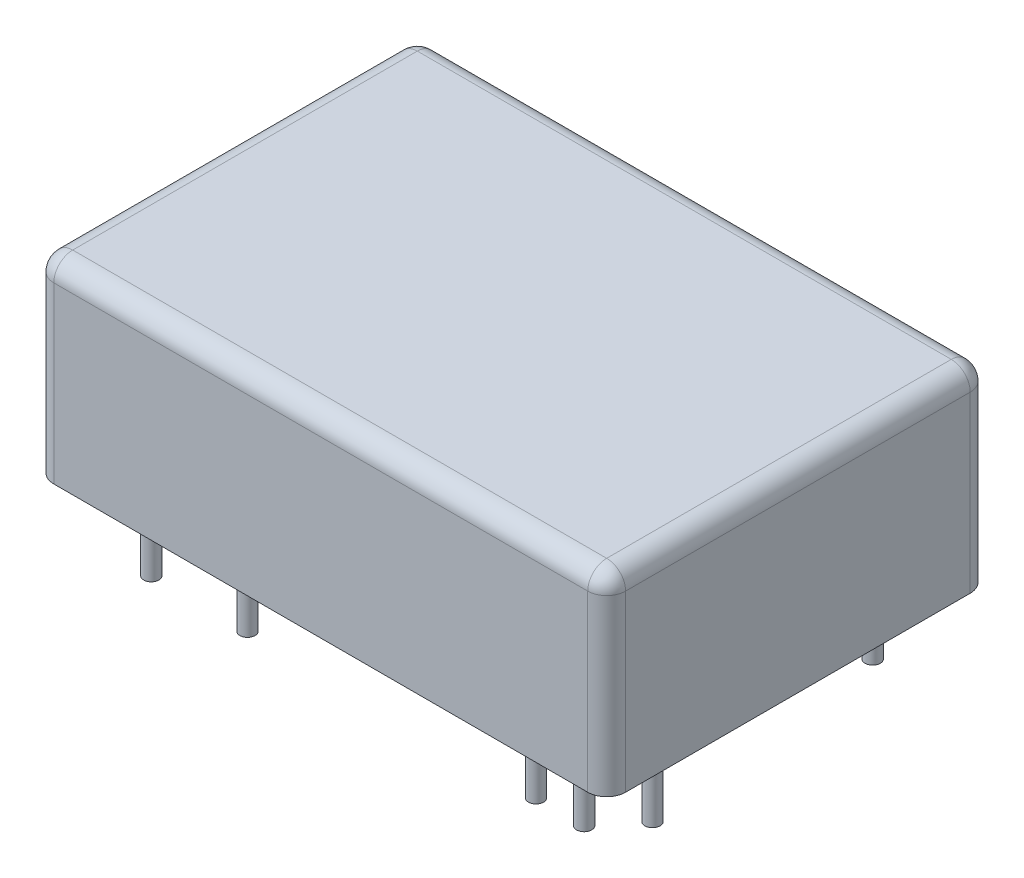
ISO-10303-21;
HEADER;
FILE_DESCRIPTION(('STEP AP214'),'2;1');
FILE_NAME('part.step','',(''),(''),'','','');
FILE_SCHEMA(('AUTOMOTIVE_DESIGN { 1 0 10303 214 1 1 1 1 }'));
ENDSEC;
DATA;
#1=APPLICATION_CONTEXT('core data for automotive mechanical design processes');
#2=APPLICATION_PROTOCOL_DEFINITION('international standard','automotive_design',2000,#1);
#3=PRODUCT_CONTEXT('',#1,'mechanical');
#4=PRODUCT('Part','Part','',(#3));
#5=PRODUCT_RELATED_PRODUCT_CATEGORY('part','',(#4));
#6=PRODUCT_DEFINITION_FORMATION('','',#4);
#7=PRODUCT_DEFINITION_CONTEXT('part definition',#1,'design');
#8=PRODUCT_DEFINITION('design','',#6,#7);
#9=PRODUCT_DEFINITION_SHAPE('','',#8);
#10=(LENGTH_UNIT() NAMED_UNIT(*) SI_UNIT(.MILLI.,.METRE.));
#11=(NAMED_UNIT(*) PLANE_ANGLE_UNIT() SI_UNIT($,.RADIAN.));
#12=(NAMED_UNIT(*) SI_UNIT($,.STERADIAN.) SOLID_ANGLE_UNIT());
#13=UNCERTAINTY_MEASURE_WITH_UNIT(LENGTH_MEASURE(1.E-05),#10,'distance_accuracy_value','');
#14=(GEOMETRIC_REPRESENTATION_CONTEXT(3) GLOBAL_UNCERTAINTY_ASSIGNED_CONTEXT((#13)) GLOBAL_UNIT_ASSIGNED_CONTEXT((#10,
#11,#12)) REPRESENTATION_CONTEXT('',''));
#15=CARTESIAN_POINT('',(0.,0.,0.));
#16=DIRECTION('',(0.,0.,1.));
#17=DIRECTION('',(1.,0.,0.));
#18=AXIS2_PLACEMENT_3D('',#15,#16,#17);
#19=CARTESIAN_POINT('',(15.1,10.2,-10.1));
#20=DIRECTION('',(-1.,0.,0.));
#21=DIRECTION('',(0.,0.,1.));
#22=AXIS2_PLACEMENT_3D('',#19,#20,#21);
#23=PLANE('',#22);
#24=DIRECTION('',(0.,0.,-1.));
#25=VECTOR('',#24,1.);
#26=CARTESIAN_POINT('',(15.1,0.,-10.1));
#27=LINE('',#26,#25);
#28=CARTESIAN_POINT('',(15.1,0.,9.1));
#29=VERTEX_POINT('',#28);
#30=CARTESIAN_POINT('',(15.1,0.,-9.1));
#31=VERTEX_POINT('',#30);
#32=EDGE_CURVE('E205',#29,#31,#27,.T.);
#33=ORIENTED_EDGE('',*,*,#32,.T.);
#34=DIRECTION('',(0.,-1.,0.));
#35=VECTOR('',#34,1.);
#36=CARTESIAN_POINT('',(15.1,10.2,-9.1));
#37=LINE('',#36,#35);
#38=CARTESIAN_POINT('',(15.1,9.2,-9.1));
#39=VERTEX_POINT('',#38);
#40=EDGE_CURVE('E50',#31,#39,#37,.F.);
#41=ORIENTED_EDGE('',*,*,#40,.T.);
#42=DIRECTION('',(0.,0.,-1.));
#43=VECTOR('',#42,1.);
#44=CARTESIAN_POINT('',(15.1,9.2,10.1));
#45=LINE('',#44,#43);
#46=CARTESIAN_POINT('',(15.1,9.2,9.1));
#47=VERTEX_POINT('',#46);
#48=EDGE_CURVE('E55',#39,#47,#45,.F.);
#49=ORIENTED_EDGE('',*,*,#48,.T.);
#50=DIRECTION('',(0.,-1.,0.));
#51=VECTOR('',#50,1.);
#52=CARTESIAN_POINT('',(15.1,10.2,9.1));
#53=LINE('',#52,#51);
#54=EDGE_CURVE('E169',#47,#29,#53,.T.);
#55=ORIENTED_EDGE('',*,*,#54,.T.);
#56=EDGE_LOOP('',(#33,#41,#49,#55));
#57=FACE_BOUND('',#56,.T.);
#58=ADVANCED_FACE('F35',(#57),#23,.F.);
#59=CARTESIAN_POINT('',(-15.1,10.2,-10.1));
#60=DIRECTION('',(0.,0.,1.));
#61=DIRECTION('',(1.,0.,0.));
#62=AXIS2_PLACEMENT_3D('',#59,#60,#61);
#63=PLANE('',#62);
#64=DIRECTION('',(-1.,0.,0.));
#65=VECTOR('',#64,1.);
#66=CARTESIAN_POINT('',(-15.1,0.,-10.1));
#67=LINE('',#66,#65);
#68=CARTESIAN_POINT('',(14.1,0.,-10.1));
#69=VERTEX_POINT('',#68);
#70=CARTESIAN_POINT('',(-14.1,0.,-10.1));
#71=VERTEX_POINT('',#70);
#72=EDGE_CURVE('E287',#69,#71,#67,.T.);
#73=ORIENTED_EDGE('',*,*,#72,.T.);
#74=DIRECTION('',(0.,-1.,0.));
#75=VECTOR('',#74,1.);
#76=CARTESIAN_POINT('',(-14.1,10.2,-10.1));
#77=LINE('',#76,#75);
#78=CARTESIAN_POINT('',(-14.1,9.2,-10.1));
#79=VERTEX_POINT('',#78);
#80=EDGE_CURVE('E167',#71,#79,#77,.F.);
#81=ORIENTED_EDGE('',*,*,#80,.T.);
#82=DIRECTION('',(-1.,0.,0.));
#83=VECTOR('',#82,1.);
#84=CARTESIAN_POINT('',(15.1,9.2,-10.1));
#85=LINE('',#84,#83);
#86=CARTESIAN_POINT('',(14.1,9.2,-10.1));
#87=VERTEX_POINT('',#86);
#88=EDGE_CURVE('E165',#79,#87,#85,.F.);
#89=ORIENTED_EDGE('',*,*,#88,.T.);
#90=DIRECTION('',(0.,-1.,0.));
#91=VECTOR('',#90,1.);
#92=CARTESIAN_POINT('',(14.1,10.2,-10.1));
#93=LINE('',#92,#91);
#94=EDGE_CURVE('E163',#87,#69,#93,.T.);
#95=ORIENTED_EDGE('',*,*,#94,.T.);
#96=EDGE_LOOP('',(#73,#81,#89,#95));
#97=FACE_BOUND('',#96,.T.);
#98=ADVANCED_FACE('F297',(#97),#63,.F.);
#99=CARTESIAN_POINT('',(-15.1,10.2,-10.1));
#100=DIRECTION('',(1.,0.,0.));
#101=DIRECTION('',(0.,0.,-1.));
#102=AXIS2_PLACEMENT_3D('',#99,#100,#101);
#103=PLANE('',#102);
#104=DIRECTION('',(0.,0.,1.));
#105=VECTOR('',#104,1.);
#106=CARTESIAN_POINT('',(-15.1,0.,-10.1));
#107=LINE('',#106,#105);
#108=CARTESIAN_POINT('',(-15.1,0.,-9.1));
#109=VERTEX_POINT('',#108);
#110=CARTESIAN_POINT('',(-15.1,0.,9.1));
#111=VERTEX_POINT('',#110);
#112=EDGE_CURVE('E263',#109,#111,#107,.T.);
#113=ORIENTED_EDGE('',*,*,#112,.T.);
#114=DIRECTION('',(0.,-1.,0.));
#115=VECTOR('',#114,1.);
#116=CARTESIAN_POINT('',(-15.1,10.2,9.1));
#117=LINE('',#116,#115);
#118=CARTESIAN_POINT('',(-15.1,9.2,9.1));
#119=VERTEX_POINT('',#118);
#120=EDGE_CURVE('E161',#111,#119,#117,.F.);
#121=ORIENTED_EDGE('',*,*,#120,.T.);
#122=DIRECTION('',(0.,0.,1.));
#123=VECTOR('',#122,1.);
#124=CARTESIAN_POINT('',(-15.1,9.2,-10.1));
#125=LINE('',#124,#123);
#126=CARTESIAN_POINT('',(-15.1,9.2,-9.1));
#127=VERTEX_POINT('',#126);
#128=EDGE_CURVE('E159',#119,#127,#125,.F.);
#129=ORIENTED_EDGE('',*,*,#128,.T.);
#130=DIRECTION('',(0.,-1.,0.));
#131=VECTOR('',#130,1.);
#132=CARTESIAN_POINT('',(-15.1,10.2,-9.1));
#133=LINE('',#132,#131);
#134=EDGE_CURVE('E157',#127,#109,#133,.T.);
#135=ORIENTED_EDGE('',*,*,#134,.T.);
#136=EDGE_LOOP('',(#113,#121,#129,#135));
#137=FACE_BOUND('',#136,.T.);
#138=ADVANCED_FACE('F272',(#137),#103,.F.);
#139=CARTESIAN_POINT('',(-15.1,10.2,10.1));
#140=DIRECTION('',(0.,0.,-1.));
#141=DIRECTION('',(-1.,0.,0.));
#142=AXIS2_PLACEMENT_3D('',#139,#140,#141);
#143=PLANE('',#142);
#144=DIRECTION('',(1.,0.,0.));
#145=VECTOR('',#144,1.);
#146=CARTESIAN_POINT('',(-15.1,9.2,10.1));
#147=LINE('',#146,#145);
#148=CARTESIAN_POINT('',(14.1,9.2,10.1));
#149=VERTEX_POINT('',#148);
#150=CARTESIAN_POINT('',(-14.1,9.2,10.1));
#151=VERTEX_POINT('',#150);
#152=EDGE_CURVE('E119',#149,#151,#147,.F.);
#153=ORIENTED_EDGE('',*,*,#152,.T.);
#154=DIRECTION('',(0.,-1.,0.));
#155=VECTOR('',#154,1.);
#156=CARTESIAN_POINT('',(-14.1,10.2,10.1));
#157=LINE('',#156,#155);
#158=CARTESIAN_POINT('',(-14.1,0.,10.1));
#159=VERTEX_POINT('',#158);
#160=EDGE_CURVE('E155',#151,#159,#157,.T.);
#161=ORIENTED_EDGE('',*,*,#160,.T.);
#162=DIRECTION('',(1.,0.,0.));
#163=VECTOR('',#162,1.);
#164=CARTESIAN_POINT('',(-15.1,0.,10.1));
#165=LINE('',#164,#163);
#166=CARTESIAN_POINT('',(14.1,0.,10.1));
#167=VERTEX_POINT('',#166);
#168=EDGE_CURVE('E142',#159,#167,#165,.T.);
#169=ORIENTED_EDGE('',*,*,#168,.T.);
#170=DIRECTION('',(0.,-1.,0.));
#171=VECTOR('',#170,1.);
#172=CARTESIAN_POINT('',(14.1,10.2,10.1));
#173=LINE('',#172,#171);
#174=EDGE_CURVE('E148',#167,#149,#173,.F.);
#175=ORIENTED_EDGE('',*,*,#174,.T.);
#176=EDGE_LOOP('',(#153,#161,#169,#175));
#177=FACE_BOUND('',#176,.T.);
#178=ADVANCED_FACE('F399',(#177),#143,.F.);
#179=CARTESIAN_POINT('',(0.,10.2,0.));
#180=DIRECTION('',(0.,1.,0.));
#181=DIRECTION('',(0.,0.,1.));
#182=AXIS2_PLACEMENT_3D('',#179,#180,#181);
#183=PLANE('',#182);
#184=DIRECTION('',(0.,0.,1.));
#185=VECTOR('',#184,1.);
#186=CARTESIAN_POINT('',(-14.1,10.2,10.1));
#187=LINE('',#186,#185);
#188=CARTESIAN_POINT('',(-14.1,10.2,-9.1));
#189=VERTEX_POINT('',#188);
#190=CARTESIAN_POINT('',(-14.1,10.2,9.1));
#191=VERTEX_POINT('',#190);
#192=EDGE_CURVE('E146',#189,#191,#187,.T.);
#193=ORIENTED_EDGE('',*,*,#192,.T.);
#194=DIRECTION('',(1.,0.,0.));
#195=VECTOR('',#194,1.);
#196=CARTESIAN_POINT('',(15.1,10.2,9.1));
#197=LINE('',#196,#195);
#198=CARTESIAN_POINT('',(14.1,10.2,9.1));
#199=VERTEX_POINT('',#198);
#200=EDGE_CURVE('E117',#191,#199,#197,.T.);
#201=ORIENTED_EDGE('',*,*,#200,.T.);
#202=DIRECTION('',(0.,0.,-1.));
#203=VECTOR('',#202,1.);
#204=CARTESIAN_POINT('',(14.1,10.2,-10.1));
#205=LINE('',#204,#203);
#206=CARTESIAN_POINT('',(14.1,10.2,-9.1));
#207=VERTEX_POINT('',#206);
#208=EDGE_CURVE('E135',#199,#207,#205,.T.);
#209=ORIENTED_EDGE('',*,*,#208,.T.);
#210=DIRECTION('',(-1.,0.,0.));
#211=VECTOR('',#210,1.);
#212=CARTESIAN_POINT('',(-15.1,10.2,-9.1));
#213=LINE('',#212,#211);
#214=EDGE_CURVE('E141',#207,#189,#213,.T.);
#215=ORIENTED_EDGE('',*,*,#214,.T.);
#216=EDGE_LOOP('',(#193,#201,#209,#215));
#217=FACE_BOUND('',#216,.T.);
#218=ADVANCED_FACE('F144',(#217),#183,.T.);
#219=CARTESIAN_POINT('',(0.,0.,0.));
#220=DIRECTION('',(0.,1.,0.));
#221=DIRECTION('',(0.,0.,1.));
#222=AXIS2_PLACEMENT_3D('',#219,#220,#221);
#223=PLANE('',#222);
#224=CARTESIAN_POINT('',(11.53,0.,-7.52));
#225=DIRECTION('',(0.,1.,0.));
#226=DIRECTION('',(0.,0.,1.));
#227=AXIS2_PLACEMENT_3D('',#224,#225,#226);
#228=CIRCLE('',#227,0.399999999999998);
#229=CARTESIAN_POINT('',(11.53,0.,-7.12));
#230=VERTEX_POINT('',#229);
#231=EDGE_CURVE('E11',#230,#230,#228,.F.);
#232=ORIENTED_EDGE('',*,*,#231,.F.);
#233=EDGE_LOOP('',(#232));
#234=FACE_BOUND('',#233,.T.);
#235=CARTESIAN_POINT('',(8.99,0.,-7.52));
#236=DIRECTION('',(0.,1.,0.));
#237=DIRECTION('',(0.,0.,1.));
#238=AXIS2_PLACEMENT_3D('',#235,#236,#237);
#239=CIRCLE('',#238,0.399999999999998);
#240=CARTESIAN_POINT('',(8.99,0.,-7.12));
#241=VERTEX_POINT('',#240);
#242=EDGE_CURVE('E43',#241,#241,#239,.F.);
#243=ORIENTED_EDGE('',*,*,#242,.F.);
#244=EDGE_LOOP('',(#243));
#245=FACE_BOUND('',#244,.T.);
#246=CARTESIAN_POINT('',(-6.25,0.,-7.52));
#247=DIRECTION('',(0.,1.,0.));
#248=DIRECTION('',(0.,0.,1.));
#249=AXIS2_PLACEMENT_3D('',#246,#247,#248);
#250=CIRCLE('',#249,0.399999999999998);
#251=CARTESIAN_POINT('',(-6.25,0.,-7.12));
#252=VERTEX_POINT('',#251);
#253=EDGE_CURVE('E226',#252,#252,#250,.F.);
#254=ORIENTED_EDGE('',*,*,#253,.F.);
#255=EDGE_LOOP('',(#254));
#256=FACE_BOUND('',#255,.T.);
#257=CARTESIAN_POINT('',(-11.33,0.,-7.52));
#258=DIRECTION('',(0.,1.,0.));
#259=DIRECTION('',(0.,0.,1.));
#260=AXIS2_PLACEMENT_3D('',#257,#258,#259);
#261=CIRCLE('',#260,0.399999999999998);
#262=CARTESIAN_POINT('',(-11.33,0.,-7.12));
#263=VERTEX_POINT('',#262);
#264=EDGE_CURVE('E223',#263,#263,#261,.F.);
#265=ORIENTED_EDGE('',*,*,#264,.F.);
#266=EDGE_LOOP('',(#265));
#267=FACE_BOUND('',#266,.T.);
#268=CARTESIAN_POINT('',(-11.33,0.,7.72));
#269=DIRECTION('',(0.,1.,0.));
#270=DIRECTION('',(0.,0.,1.));
#271=AXIS2_PLACEMENT_3D('',#268,#269,#270);
#272=CIRCLE('',#271,0.399999999999998);
#273=CARTESIAN_POINT('',(-11.33,0.,8.12));
#274=VERTEX_POINT('',#273);
#275=EDGE_CURVE('E220',#274,#274,#272,.F.);
#276=ORIENTED_EDGE('',*,*,#275,.F.);
#277=EDGE_LOOP('',(#276));
#278=FACE_BOUND('',#277,.T.);
#279=CARTESIAN_POINT('',(-6.25,0.,7.72));
#280=DIRECTION('',(0.,1.,0.));
#281=DIRECTION('',(0.,0.,1.));
#282=AXIS2_PLACEMENT_3D('',#279,#280,#281);
#283=CIRCLE('',#282,0.399999999999998);
#284=CARTESIAN_POINT('',(-6.25,0.,8.12));
#285=VERTEX_POINT('',#284);
#286=EDGE_CURVE('E217',#285,#285,#283,.F.);
#287=ORIENTED_EDGE('',*,*,#286,.F.);
#288=EDGE_LOOP('',(#287));
#289=FACE_BOUND('',#288,.T.);
#290=CARTESIAN_POINT('',(6.45,0.,-7.52));
#291=DIRECTION('',(0.,1.,0.));
#292=DIRECTION('',(0.,0.,1.));
#293=AXIS2_PLACEMENT_3D('',#290,#291,#292);
#294=CIRCLE('',#293,0.399999999999998);
#295=CARTESIAN_POINT('',(6.45,0.,-7.12));
#296=VERTEX_POINT('',#295);
#297=EDGE_CURVE('E214',#296,#296,#294,.F.);
#298=ORIENTED_EDGE('',*,*,#297,.F.);
#299=EDGE_LOOP('',(#298));
#300=FACE_BOUND('',#299,.T.);
#301=CARTESIAN_POINT('',(13.15,0.,5.73));
#302=DIRECTION('',(0.,1.,0.));
#303=DIRECTION('',(0.,0.,1.));
#304=AXIS2_PLACEMENT_3D('',#301,#302,#303);
#305=CIRCLE('',#304,0.399999999999998);
#306=CARTESIAN_POINT('',(13.15,0.,6.13));
#307=VERTEX_POINT('',#306);
#308=EDGE_CURVE('E211',#307,#307,#305,.F.);
#309=ORIENTED_EDGE('',*,*,#308,.F.);
#310=EDGE_LOOP('',(#309));
#311=FACE_BOUND('',#310,.T.);
#312=CARTESIAN_POINT('',(8.99,0.,7.72));
#313=DIRECTION('',(0.,1.,0.));
#314=DIRECTION('',(0.,0.,1.));
#315=AXIS2_PLACEMENT_3D('',#312,#313,#314);
#316=CIRCLE('',#315,0.399999999999998);
#317=CARTESIAN_POINT('',(8.99,0.,8.12));
#318=VERTEX_POINT('',#317);
#319=EDGE_CURVE('E208',#318,#318,#316,.F.);
#320=ORIENTED_EDGE('',*,*,#319,.F.);
#321=EDGE_LOOP('',(#320));
#322=FACE_BOUND('',#321,.T.);
#323=CARTESIAN_POINT('',(11.53,0.,7.72));
#324=DIRECTION('',(0.,1.,0.));
#325=DIRECTION('',(0.,0.,1.));
#326=AXIS2_PLACEMENT_3D('',#323,#324,#325);
#327=CIRCLE('',#326,0.399999999999998);
#328=CARTESIAN_POINT('',(11.53,0.,8.12));
#329=VERTEX_POINT('',#328);
#330=EDGE_CURVE('E180',#329,#329,#327,.F.);
#331=ORIENTED_EDGE('',*,*,#330,.F.);
#332=EDGE_LOOP('',(#331));
#333=FACE_BOUND('',#332,.T.);
#334=ORIENTED_EDGE('',*,*,#168,.F.);
#335=CARTESIAN_POINT('',(-14.1,0.,9.1));
#336=DIRECTION('',(0.,1.,0.));
#337=DIRECTION('',(0.,0.,1.));
#338=AXIS2_PLACEMENT_3D('',#335,#336,#337);
#339=CIRCLE('',#338,1.);
#340=EDGE_CURVE('E179',#159,#111,#339,.F.);
#341=ORIENTED_EDGE('',*,*,#340,.T.);
#342=ORIENTED_EDGE('',*,*,#112,.F.);
#343=CARTESIAN_POINT('',(-14.1,0.,-9.1));
#344=DIRECTION('',(0.,1.,0.));
#345=DIRECTION('',(0.,0.,1.));
#346=AXIS2_PLACEMENT_3D('',#343,#344,#345);
#347=CIRCLE('',#346,1.);
#348=EDGE_CURVE('E177',#109,#71,#347,.F.);
#349=ORIENTED_EDGE('',*,*,#348,.T.);
#350=ORIENTED_EDGE('',*,*,#72,.F.);
#351=CARTESIAN_POINT('',(14.1,0.,-9.1));
#352=DIRECTION('',(0.,1.,0.));
#353=DIRECTION('',(0.,0.,1.));
#354=AXIS2_PLACEMENT_3D('',#351,#352,#353);
#355=CIRCLE('',#354,1.);
#356=EDGE_CURVE('E175',#69,#31,#355,.F.);
#357=ORIENTED_EDGE('',*,*,#356,.T.);
#358=ORIENTED_EDGE('',*,*,#32,.F.);
#359=CARTESIAN_POINT('',(14.1,0.,9.1));
#360=DIRECTION('',(0.,1.,0.));
#361=DIRECTION('',(0.,0.,1.));
#362=AXIS2_PLACEMENT_3D('',#359,#360,#361);
#363=CIRCLE('',#362,1.);
#364=EDGE_CURVE('E173',#29,#167,#363,.F.);
#365=ORIENTED_EDGE('',*,*,#364,.T.);
#366=EDGE_LOOP('',(#334,#341,#342,#349,#350,#357,#358,#365));
#367=FACE_BOUND('',#366,.T.);
#368=ADVANCED_FACE('F233',(#234,#245,#256,#267,#278,#289,#300,#311,#322,#333,#367),#223,.F.);
#369=CARTESIAN_POINT('',(-14.1,10.2,-9.1));
#370=DIRECTION('',(0.,-1.,0.));
#371=DIRECTION('',(0.,0.,-1.));
#372=AXIS2_PLACEMENT_3D('',#369,#370,#371);
#373=CYLINDRICAL_SURFACE('',#372,1.);
#374=ORIENTED_EDGE('',*,*,#348,.F.);
#375=ORIENTED_EDGE('',*,*,#134,.F.);
#376=CARTESIAN_POINT('',(-14.1,9.2,-9.1));
#377=DIRECTION('',(0.,1.,0.));
#378=DIRECTION('',(0.,0.,1.));
#379=AXIS2_PLACEMENT_3D('',#376,#377,#378);
#380=CIRCLE('',#379,1.);
#381=EDGE_CURVE('E202',#79,#127,#380,.T.);
#382=ORIENTED_EDGE('',*,*,#381,.F.);
#383=ORIENTED_EDGE('',*,*,#80,.F.);
#384=EDGE_LOOP('',(#374,#375,#382,#383));
#385=FACE_BOUND('',#384,.T.);
#386=ADVANCED_FACE('F37',(#385),#373,.T.);
#387=CARTESIAN_POINT('',(0.,9.2,-9.1));
#388=DIRECTION('',(1.,0.,0.));
#389=DIRECTION('',(0.,0.,-1.));
#390=AXIS2_PLACEMENT_3D('',#387,#388,#389);
#391=CYLINDRICAL_SURFACE('',#390,1.);
#392=CARTESIAN_POINT('',(14.1,9.2,-9.1));
#393=DIRECTION('',(1.,0.,0.));
#394=DIRECTION('',(0.,1.,0.));
#395=AXIS2_PLACEMENT_3D('',#392,#393,#394);
#396=CIRCLE('',#395,1.);
#397=EDGE_CURVE('E196',#87,#207,#396,.T.);
#398=ORIENTED_EDGE('',*,*,#397,.F.);
#399=ORIENTED_EDGE('',*,*,#88,.F.);
#400=CARTESIAN_POINT('',(-14.1,9.2,-9.1));
#401=DIRECTION('',(-1.,0.,0.));
#402=DIRECTION('',(0.,0.,1.));
#403=AXIS2_PLACEMENT_3D('',#400,#401,#402);
#404=CIRCLE('',#403,1.);
#405=EDGE_CURVE('E199',#189,#79,#404,.T.);
#406=ORIENTED_EDGE('',*,*,#405,.F.);
#407=ORIENTED_EDGE('',*,*,#214,.F.);
#408=EDGE_LOOP('',(#398,#399,#406,#407));
#409=FACE_BOUND('',#408,.T.);
#410=ADVANCED_FACE('F294',(#409),#391,.T.);
#411=CARTESIAN_POINT('',(14.1,10.2,-9.1));
#412=DIRECTION('',(0.,-1.,0.));
#413=DIRECTION('',(0.,0.,-1.));
#414=AXIS2_PLACEMENT_3D('',#411,#412,#413);
#415=CYLINDRICAL_SURFACE('',#414,1.);
#416=ORIENTED_EDGE('',*,*,#356,.F.);
#417=ORIENTED_EDGE('',*,*,#94,.F.);
#418=CARTESIAN_POINT('',(14.1,9.2,-9.1));
#419=DIRECTION('',(0.,1.,0.));
#420=DIRECTION('',(0.,0.,1.));
#421=AXIS2_PLACEMENT_3D('',#418,#419,#420);
#422=CIRCLE('',#421,1.);
#423=EDGE_CURVE('E193',#39,#87,#422,.T.);
#424=ORIENTED_EDGE('',*,*,#423,.F.);
#425=ORIENTED_EDGE('',*,*,#40,.F.);
#426=EDGE_LOOP('',(#416,#417,#424,#425));
#427=FACE_BOUND('',#426,.T.);
#428=ADVANCED_FACE('F300',(#427),#415,.T.);
#429=CARTESIAN_POINT('',(-14.1,9.2,-9.1));
#430=DIRECTION('',(0.,0.,1.));
#431=DIRECTION('',(1.,0.,0.));
#432=AXIS2_PLACEMENT_3D('',#429,#430,#431);
#433=SPHERICAL_SURFACE('',#432,1.);
#434=ORIENTED_EDGE('',*,*,#405,.T.);
#435=ORIENTED_EDGE('',*,*,#381,.T.);
#436=CARTESIAN_POINT('',(-14.1,9.2,-9.1));
#437=DIRECTION('',(0.,0.,-1.));
#438=DIRECTION('',(-1.,0.,0.));
#439=AXIS2_PLACEMENT_3D('',#436,#437,#438);
#440=CIRCLE('',#439,1.);
#441=EDGE_CURVE('E190',#189,#127,#440,.F.);
#442=ORIENTED_EDGE('',*,*,#441,.F.);
#443=EDGE_LOOP('',(#434,#435,#442));
#444=FACE_BOUND('',#443,.T.);
#445=ADVANCED_FACE('F279',(#444),#433,.T.);
#446=CARTESIAN_POINT('',(14.1,9.2,-9.1));
#447=DIRECTION('',(0.,0.,1.));
#448=DIRECTION('',(1.,0.,0.));
#449=AXIS2_PLACEMENT_3D('',#446,#447,#448);
#450=SPHERICAL_SURFACE('',#449,1.);
#451=ORIENTED_EDGE('',*,*,#423,.T.);
#452=ORIENTED_EDGE('',*,*,#397,.T.);
#453=CARTESIAN_POINT('',(14.1,9.2,-9.1));
#454=DIRECTION('',(0.,0.,-1.));
#455=DIRECTION('',(-1.,0.,0.));
#456=AXIS2_PLACEMENT_3D('',#453,#454,#455);
#457=CIRCLE('',#456,1.);
#458=EDGE_CURVE('E138',#39,#207,#457,.F.);
#459=ORIENTED_EDGE('',*,*,#458,.F.);
#460=EDGE_LOOP('',(#451,#452,#459));
#461=FACE_BOUND('',#460,.T.);
#462=ADVANCED_FACE('F374',(#461),#450,.T.);
#463=CARTESIAN_POINT('',(-14.1,10.2,9.1));
#464=DIRECTION('',(0.,-1.,0.));
#465=DIRECTION('',(0.,0.,-1.));
#466=AXIS2_PLACEMENT_3D('',#463,#464,#465);
#467=CYLINDRICAL_SURFACE('',#466,1.);
#468=ORIENTED_EDGE('',*,*,#340,.F.);
#469=ORIENTED_EDGE('',*,*,#160,.F.);
#470=CARTESIAN_POINT('',(-14.1,9.2,9.1));
#471=DIRECTION('',(0.,1.,0.));
#472=DIRECTION('',(0.,0.,1.));
#473=AXIS2_PLACEMENT_3D('',#470,#471,#472);
#474=CIRCLE('',#473,1.);
#475=EDGE_CURVE('E186',#119,#151,#474,.T.);
#476=ORIENTED_EDGE('',*,*,#475,.F.);
#477=ORIENTED_EDGE('',*,*,#120,.F.);
#478=EDGE_LOOP('',(#468,#469,#476,#477));
#479=FACE_BOUND('',#478,.T.);
#480=ADVANCED_FACE('F268',(#479),#467,.T.);
#481=CARTESIAN_POINT('',(-14.1,9.2,0.));
#482=DIRECTION('',(0.,0.,-1.));
#483=DIRECTION('',(-1.,0.,0.));
#484=AXIS2_PLACEMENT_3D('',#481,#482,#483);
#485=CYLINDRICAL_SURFACE('',#484,1.);
#486=ORIENTED_EDGE('',*,*,#441,.T.);
#487=ORIENTED_EDGE('',*,*,#128,.F.);
#488=CARTESIAN_POINT('',(-14.1,9.2,9.1));
#489=DIRECTION('',(0.,0.,1.));
#490=DIRECTION('',(1.,0.,0.));
#491=AXIS2_PLACEMENT_3D('',#488,#489,#490);
#492=CIRCLE('',#491,1.);
#493=EDGE_CURVE('E132',#191,#119,#492,.T.);
#494=ORIENTED_EDGE('',*,*,#493,.F.);
#495=ORIENTED_EDGE('',*,*,#192,.F.);
#496=EDGE_LOOP('',(#486,#487,#494,#495));
#497=FACE_BOUND('',#496,.T.);
#498=ADVANCED_FACE('F275',(#497),#485,.T.);
#499=CARTESIAN_POINT('',(14.1,9.2,0.));
#500=DIRECTION('',(0.,0.,1.));
#501=DIRECTION('',(1.,0.,0.));
#502=AXIS2_PLACEMENT_3D('',#499,#500,#501);
#503=CYLINDRICAL_SURFACE('',#502,1.);
#504=ORIENTED_EDGE('',*,*,#458,.T.);
#505=ORIENTED_EDGE('',*,*,#208,.F.);
#506=CARTESIAN_POINT('',(14.1,9.2,9.1));
#507=DIRECTION('',(0.,0.,1.));
#508=DIRECTION('',(1.,0.,0.));
#509=AXIS2_PLACEMENT_3D('',#506,#507,#508);
#510=CIRCLE('',#509,1.);
#511=EDGE_CURVE('E126',#47,#199,#510,.T.);
#512=ORIENTED_EDGE('',*,*,#511,.F.);
#513=ORIENTED_EDGE('',*,*,#48,.F.);
#514=EDGE_LOOP('',(#504,#505,#512,#513));
#515=FACE_BOUND('',#514,.T.);
#516=ADVANCED_FACE('F136',(#515),#503,.T.);
#517=CARTESIAN_POINT('',(14.1,10.2,9.1));
#518=DIRECTION('',(0.,-1.,0.));
#519=DIRECTION('',(0.,0.,-1.));
#520=AXIS2_PLACEMENT_3D('',#517,#518,#519);
#521=CYLINDRICAL_SURFACE('',#520,1.);
#522=ORIENTED_EDGE('',*,*,#364,.F.);
#523=ORIENTED_EDGE('',*,*,#54,.F.);
#524=CARTESIAN_POINT('',(14.1,9.2,9.1));
#525=DIRECTION('',(0.,1.,0.));
#526=DIRECTION('',(0.,0.,1.));
#527=AXIS2_PLACEMENT_3D('',#524,#525,#526);
#528=CIRCLE('',#527,1.);
#529=EDGE_CURVE('E130',#149,#47,#528,.T.);
#530=ORIENTED_EDGE('',*,*,#529,.F.);
#531=ORIENTED_EDGE('',*,*,#174,.F.);
#532=EDGE_LOOP('',(#522,#523,#530,#531));
#533=FACE_BOUND('',#532,.T.);
#534=ADVANCED_FACE('F363',(#533),#521,.T.);
#535=CARTESIAN_POINT('',(-14.1,9.2,9.1));
#536=DIRECTION('',(0.,0.,1.));
#537=DIRECTION('',(1.,0.,0.));
#538=AXIS2_PLACEMENT_3D('',#535,#536,#537);
#539=SPHERICAL_SURFACE('',#538,1.);
#540=ORIENTED_EDGE('',*,*,#493,.T.);
#541=ORIENTED_EDGE('',*,*,#475,.T.);
#542=CARTESIAN_POINT('',(-14.1,9.2,9.1));
#543=DIRECTION('',(-1.,0.,0.));
#544=DIRECTION('',(0.,0.,1.));
#545=AXIS2_PLACEMENT_3D('',#542,#543,#544);
#546=CIRCLE('',#545,1.);
#547=EDGE_CURVE('E122',#191,#151,#546,.F.);
#548=ORIENTED_EDGE('',*,*,#547,.F.);
#549=EDGE_LOOP('',(#540,#541,#548));
#550=FACE_BOUND('',#549,.T.);
#551=ADVANCED_FACE('F360',(#550),#539,.T.);
#552=CARTESIAN_POINT('',(14.1,9.2,9.1));
#553=DIRECTION('',(0.,0.,1.));
#554=DIRECTION('',(1.,0.,0.));
#555=AXIS2_PLACEMENT_3D('',#552,#553,#554);
#556=SPHERICAL_SURFACE('',#555,1.);
#557=ORIENTED_EDGE('',*,*,#529,.T.);
#558=ORIENTED_EDGE('',*,*,#511,.T.);
#559=CARTESIAN_POINT('',(14.1,9.2,9.1));
#560=DIRECTION('',(1.,0.,0.));
#561=DIRECTION('',(0.,0.,-1.));
#562=AXIS2_PLACEMENT_3D('',#559,#560,#561);
#563=CIRCLE('',#562,1.);
#564=EDGE_CURVE('E113',#149,#199,#563,.F.);
#565=ORIENTED_EDGE('',*,*,#564,.F.);
#566=EDGE_LOOP('',(#557,#558,#565));
#567=FACE_BOUND('',#566,.T.);
#568=ADVANCED_FACE('F128',(#567),#556,.T.);
#569=CARTESIAN_POINT('',(0.,9.2,9.1));
#570=DIRECTION('',(-1.,0.,0.));
#571=DIRECTION('',(0.,0.,1.));
#572=AXIS2_PLACEMENT_3D('',#569,#570,#571);
#573=CYLINDRICAL_SURFACE('',#572,1.);
#574=ORIENTED_EDGE('',*,*,#547,.T.);
#575=ORIENTED_EDGE('',*,*,#152,.F.);
#576=ORIENTED_EDGE('',*,*,#564,.T.);
#577=ORIENTED_EDGE('',*,*,#200,.F.);
#578=EDGE_LOOP('',(#574,#575,#576,#577));
#579=FACE_BOUND('',#578,.T.);
#580=ADVANCED_FACE('F115',(#579),#573,.T.);
#581=CARTESIAN_POINT('',(11.53,-4.,7.72));
#582=DIRECTION('',(0.,1.,0.));
#583=DIRECTION('',(0.,0.,1.));
#584=AXIS2_PLACEMENT_3D('',#581,#582,#583);
#585=CYLINDRICAL_SURFACE('',#584,0.399999999999998);
#586=CARTESIAN_POINT('',(11.53,-4.,7.72));
#587=DIRECTION('',(0.,-1.,0.));
#588=DIRECTION('',(0.,0.,-1.));
#589=AXIS2_PLACEMENT_3D('',#586,#587,#588);
#590=CIRCLE('',#589,0.399999999999998);
#591=CARTESIAN_POINT('',(11.53,-4.,7.32));
#592=VERTEX_POINT('',#591);
#593=EDGE_CURVE('E123',#592,#592,#590,.T.);
#594=ORIENTED_EDGE('',*,*,#593,.F.);
#595=EDGE_LOOP('',(#594));
#596=FACE_BOUND('',#595,.T.);
#597=ORIENTED_EDGE('',*,*,#330,.T.);
#598=EDGE_LOOP('',(#597));
#599=FACE_BOUND('',#598,.T.);
#600=ADVANCED_FACE('F357',(#596,#599),#585,.T.);
#601=CARTESIAN_POINT('',(11.53,-4.,7.72));
#602=DIRECTION('',(0.,-1.,0.));
#603=DIRECTION('',(0.,0.,-1.));
#604=AXIS2_PLACEMENT_3D('',#601,#602,#603);
#605=PLANE('',#604);
#606=ORIENTED_EDGE('',*,*,#593,.T.);
#607=EDGE_LOOP('',(#606));
#608=FACE_BOUND('',#607,.T.);
#609=ADVANCED_FACE('F491',(#608),#605,.T.);
#610=CARTESIAN_POINT('',(8.99,-4.,7.72));
#611=DIRECTION('',(0.,1.,0.));
#612=DIRECTION('',(0.,0.,1.));
#613=AXIS2_PLACEMENT_3D('',#610,#611,#612);
#614=CYLINDRICAL_SURFACE('',#613,0.399999999999998);
#615=CARTESIAN_POINT('',(8.99,-4.,7.72));
#616=DIRECTION('',(0.,-1.,0.));
#617=DIRECTION('',(0.,0.,-1.));
#618=AXIS2_PLACEMENT_3D('',#615,#616,#617);
#619=CIRCLE('',#618,0.399999999999998);
#620=CARTESIAN_POINT('',(8.99,-4.,7.32));
#621=VERTEX_POINT('',#620);
#622=EDGE_CURVE('E304',#621,#621,#619,.T.);
#623=ORIENTED_EDGE('',*,*,#622,.F.);
#624=EDGE_LOOP('',(#623));
#625=FACE_BOUND('',#624,.T.);
#626=ORIENTED_EDGE('',*,*,#319,.T.);
#627=EDGE_LOOP('',(#626));
#628=FACE_BOUND('',#627,.T.);
#629=ADVANCED_FACE('F500',(#625,#628),#614,.T.);
#630=CARTESIAN_POINT('',(8.99,-4.,7.72));
#631=DIRECTION('',(0.,-1.,0.));
#632=DIRECTION('',(0.,0.,-1.));
#633=AXIS2_PLACEMENT_3D('',#630,#631,#632);
#634=PLANE('',#633);
#635=ORIENTED_EDGE('',*,*,#622,.T.);
#636=EDGE_LOOP('',(#635));
#637=FACE_BOUND('',#636,.T.);
#638=ADVANCED_FACE('F509',(#637),#634,.T.);
#639=CARTESIAN_POINT('',(13.15,-4.,5.73));
#640=DIRECTION('',(0.,1.,0.));
#641=DIRECTION('',(0.,0.,1.));
#642=AXIS2_PLACEMENT_3D('',#639,#640,#641);
#643=CYLINDRICAL_SURFACE('',#642,0.399999999999998);
#644=CARTESIAN_POINT('',(13.15,-4.,5.73));
#645=DIRECTION('',(0.,-1.,0.));
#646=DIRECTION('',(0.,0.,-1.));
#647=AXIS2_PLACEMENT_3D('',#644,#645,#646);
#648=CIRCLE('',#647,0.399999999999998);
#649=CARTESIAN_POINT('',(13.15,-4.,5.33));
#650=VERTEX_POINT('',#649);
#651=EDGE_CURVE('E307',#650,#650,#648,.T.);
#652=ORIENTED_EDGE('',*,*,#651,.F.);
#653=EDGE_LOOP('',(#652));
#654=FACE_BOUND('',#653,.T.);
#655=ORIENTED_EDGE('',*,*,#308,.T.);
#656=EDGE_LOOP('',(#655));
#657=FACE_BOUND('',#656,.T.);
#658=ADVANCED_FACE('F518',(#654,#657),#643,.T.);
#659=CARTESIAN_POINT('',(13.15,-4.,5.73));
#660=DIRECTION('',(0.,-1.,0.));
#661=DIRECTION('',(0.,0.,-1.));
#662=AXIS2_PLACEMENT_3D('',#659,#660,#661);
#663=PLANE('',#662);
#664=ORIENTED_EDGE('',*,*,#651,.T.);
#665=EDGE_LOOP('',(#664));
#666=FACE_BOUND('',#665,.T.);
#667=ADVANCED_FACE('F527',(#666),#663,.T.);
#668=CARTESIAN_POINT('',(6.45,-4.,-7.52));
#669=DIRECTION('',(0.,1.,0.));
#670=DIRECTION('',(0.,0.,1.));
#671=AXIS2_PLACEMENT_3D('',#668,#669,#670);
#672=CYLINDRICAL_SURFACE('',#671,0.399999999999998);
#673=CARTESIAN_POINT('',(6.45,-4.,-7.52));
#674=DIRECTION('',(0.,-1.,0.));
#675=DIRECTION('',(0.,0.,-1.));
#676=AXIS2_PLACEMENT_3D('',#673,#674,#675);
#677=CIRCLE('',#676,0.399999999999998);
#678=CARTESIAN_POINT('',(6.45,-4.,-7.92));
#679=VERTEX_POINT('',#678);
#680=EDGE_CURVE('E310',#679,#679,#677,.T.);
#681=ORIENTED_EDGE('',*,*,#680,.F.);
#682=EDGE_LOOP('',(#681));
#683=FACE_BOUND('',#682,.T.);
#684=ORIENTED_EDGE('',*,*,#297,.T.);
#685=EDGE_LOOP('',(#684));
#686=FACE_BOUND('',#685,.T.);
#687=ADVANCED_FACE('F536',(#683,#686),#672,.T.);
#688=CARTESIAN_POINT('',(6.45,-4.,-7.52));
#689=DIRECTION('',(0.,-1.,0.));
#690=DIRECTION('',(0.,0.,-1.));
#691=AXIS2_PLACEMENT_3D('',#688,#689,#690);
#692=PLANE('',#691);
#693=ORIENTED_EDGE('',*,*,#680,.T.);
#694=EDGE_LOOP('',(#693));
#695=FACE_BOUND('',#694,.T.);
#696=ADVANCED_FACE('F545',(#695),#692,.T.);
#697=CARTESIAN_POINT('',(-6.25,-4.,7.72));
#698=DIRECTION('',(0.,1.,0.));
#699=DIRECTION('',(0.,0.,1.));
#700=AXIS2_PLACEMENT_3D('',#697,#698,#699);
#701=CYLINDRICAL_SURFACE('',#700,0.399999999999998);
#702=CARTESIAN_POINT('',(-6.25,-4.,7.72));
#703=DIRECTION('',(0.,-1.,0.));
#704=DIRECTION('',(0.,0.,-1.));
#705=AXIS2_PLACEMENT_3D('',#702,#703,#704);
#706=CIRCLE('',#705,0.399999999999998);
#707=CARTESIAN_POINT('',(-6.25,-4.,7.32));
#708=VERTEX_POINT('',#707);
#709=EDGE_CURVE('E313',#708,#708,#706,.T.);
#710=ORIENTED_EDGE('',*,*,#709,.F.);
#711=EDGE_LOOP('',(#710));
#712=FACE_BOUND('',#711,.T.);
#713=ORIENTED_EDGE('',*,*,#286,.T.);
#714=EDGE_LOOP('',(#713));
#715=FACE_BOUND('',#714,.T.);
#716=ADVANCED_FACE('F554',(#712,#715),#701,.T.);
#717=CARTESIAN_POINT('',(-6.25,-4.,7.72));
#718=DIRECTION('',(0.,-1.,0.));
#719=DIRECTION('',(0.,0.,-1.));
#720=AXIS2_PLACEMENT_3D('',#717,#718,#719);
#721=PLANE('',#720);
#722=ORIENTED_EDGE('',*,*,#709,.T.);
#723=EDGE_LOOP('',(#722));
#724=FACE_BOUND('',#723,.T.);
#725=ADVANCED_FACE('F563',(#724),#721,.T.);
#726=CARTESIAN_POINT('',(-11.33,-4.,7.72));
#727=DIRECTION('',(0.,1.,0.));
#728=DIRECTION('',(0.,0.,1.));
#729=AXIS2_PLACEMENT_3D('',#726,#727,#728);
#730=CYLINDRICAL_SURFACE('',#729,0.399999999999998);
#731=CARTESIAN_POINT('',(-11.33,-4.,7.72));
#732=DIRECTION('',(0.,-1.,0.));
#733=DIRECTION('',(0.,0.,-1.));
#734=AXIS2_PLACEMENT_3D('',#731,#732,#733);
#735=CIRCLE('',#734,0.399999999999998);
#736=CARTESIAN_POINT('',(-11.33,-4.,7.32));
#737=VERTEX_POINT('',#736);
#738=EDGE_CURVE('E316',#737,#737,#735,.T.);
#739=ORIENTED_EDGE('',*,*,#738,.F.);
#740=EDGE_LOOP('',(#739));
#741=FACE_BOUND('',#740,.T.);
#742=ORIENTED_EDGE('',*,*,#275,.T.);
#743=EDGE_LOOP('',(#742));
#744=FACE_BOUND('',#743,.T.);
#745=ADVANCED_FACE('F572',(#741,#744),#730,.T.);
#746=CARTESIAN_POINT('',(-11.33,-4.,7.72));
#747=DIRECTION('',(0.,-1.,0.));
#748=DIRECTION('',(0.,0.,-1.));
#749=AXIS2_PLACEMENT_3D('',#746,#747,#748);
#750=PLANE('',#749);
#751=ORIENTED_EDGE('',*,*,#738,.T.);
#752=EDGE_LOOP('',(#751));
#753=FACE_BOUND('',#752,.T.);
#754=ADVANCED_FACE('F581',(#753),#750,.T.);
#755=CARTESIAN_POINT('',(-11.33,-4.,-7.52));
#756=DIRECTION('',(0.,1.,0.));
#757=DIRECTION('',(0.,0.,1.));
#758=AXIS2_PLACEMENT_3D('',#755,#756,#757);
#759=CYLINDRICAL_SURFACE('',#758,0.399999999999998);
#760=CARTESIAN_POINT('',(-11.33,-4.,-7.52));
#761=DIRECTION('',(0.,-1.,0.));
#762=DIRECTION('',(0.,0.,-1.));
#763=AXIS2_PLACEMENT_3D('',#760,#761,#762);
#764=CIRCLE('',#763,0.399999999999998);
#765=CARTESIAN_POINT('',(-11.33,-4.,-7.92));
#766=VERTEX_POINT('',#765);
#767=EDGE_CURVE('E319',#766,#766,#764,.T.);
#768=ORIENTED_EDGE('',*,*,#767,.F.);
#769=EDGE_LOOP('',(#768));
#770=FACE_BOUND('',#769,.T.);
#771=ORIENTED_EDGE('',*,*,#264,.T.);
#772=EDGE_LOOP('',(#771));
#773=FACE_BOUND('',#772,.T.);
#774=ADVANCED_FACE('F590',(#770,#773),#759,.T.);
#775=CARTESIAN_POINT('',(-11.33,-4.,-7.52));
#776=DIRECTION('',(0.,-1.,0.));
#777=DIRECTION('',(0.,0.,-1.));
#778=AXIS2_PLACEMENT_3D('',#775,#776,#777);
#779=PLANE('',#778);
#780=ORIENTED_EDGE('',*,*,#767,.T.);
#781=EDGE_LOOP('',(#780));
#782=FACE_BOUND('',#781,.T.);
#783=ADVANCED_FACE('F599',(#782),#779,.T.);
#784=CARTESIAN_POINT('',(-6.25,-4.,-7.52));
#785=DIRECTION('',(0.,1.,0.));
#786=DIRECTION('',(0.,0.,1.));
#787=AXIS2_PLACEMENT_3D('',#784,#785,#786);
#788=CYLINDRICAL_SURFACE('',#787,0.399999999999998);
#789=CARTESIAN_POINT('',(-6.25,-4.,-7.52));
#790=DIRECTION('',(0.,-1.,0.));
#791=DIRECTION('',(0.,0.,-1.));
#792=AXIS2_PLACEMENT_3D('',#789,#790,#791);
#793=CIRCLE('',#792,0.399999999999998);
#794=CARTESIAN_POINT('',(-6.25,-4.,-7.92));
#795=VERTEX_POINT('',#794);
#796=EDGE_CURVE('E322',#795,#795,#793,.T.);
#797=ORIENTED_EDGE('',*,*,#796,.F.);
#798=EDGE_LOOP('',(#797));
#799=FACE_BOUND('',#798,.T.);
#800=ORIENTED_EDGE('',*,*,#253,.T.);
#801=EDGE_LOOP('',(#800));
#802=FACE_BOUND('',#801,.T.);
#803=ADVANCED_FACE('F608',(#799,#802),#788,.T.);
#804=CARTESIAN_POINT('',(-6.25,-4.,-7.52));
#805=DIRECTION('',(0.,-1.,0.));
#806=DIRECTION('',(0.,0.,-1.));
#807=AXIS2_PLACEMENT_3D('',#804,#805,#806);
#808=PLANE('',#807);
#809=ORIENTED_EDGE('',*,*,#796,.T.);
#810=EDGE_LOOP('',(#809));
#811=FACE_BOUND('',#810,.T.);
#812=ADVANCED_FACE('F617',(#811),#808,.T.);
#813=CARTESIAN_POINT('',(8.99,-4.,-7.52));
#814=DIRECTION('',(0.,1.,0.));
#815=DIRECTION('',(0.,0.,1.));
#816=AXIS2_PLACEMENT_3D('',#813,#814,#815);
#817=CYLINDRICAL_SURFACE('',#816,0.399999999999998);
#818=CARTESIAN_POINT('',(8.99,-4.,-7.52));
#819=DIRECTION('',(0.,-1.,0.));
#820=DIRECTION('',(0.,0.,-1.));
#821=AXIS2_PLACEMENT_3D('',#818,#819,#820);
#822=CIRCLE('',#821,0.399999999999998);
#823=CARTESIAN_POINT('',(8.99,-4.,-7.92));
#824=VERTEX_POINT('',#823);
#825=EDGE_CURVE('E325',#824,#824,#822,.T.);
#826=ORIENTED_EDGE('',*,*,#825,.F.);
#827=EDGE_LOOP('',(#826));
#828=FACE_BOUND('',#827,.T.);
#829=ORIENTED_EDGE('',*,*,#242,.T.);
#830=EDGE_LOOP('',(#829));
#831=FACE_BOUND('',#830,.T.);
#832=ADVANCED_FACE('F231',(#828,#831),#817,.T.);
#833=CARTESIAN_POINT('',(8.99,-4.,-7.52));
#834=DIRECTION('',(0.,-1.,0.));
#835=DIRECTION('',(0.,0.,-1.));
#836=AXIS2_PLACEMENT_3D('',#833,#834,#835);
#837=PLANE('',#836);
#838=ORIENTED_EDGE('',*,*,#825,.T.);
#839=EDGE_LOOP('',(#838));
#840=FACE_BOUND('',#839,.T.);
#841=ADVANCED_FACE('F337',(#840),#837,.T.);
#842=CARTESIAN_POINT('',(11.53,-4.,-7.52));
#843=DIRECTION('',(0.,1.,0.));
#844=DIRECTION('',(0.,0.,1.));
#845=AXIS2_PLACEMENT_3D('',#842,#843,#844);
#846=CYLINDRICAL_SURFACE('',#845,0.399999999999998);
#847=CARTESIAN_POINT('',(11.53,-4.,-7.52));
#848=DIRECTION('',(0.,-1.,0.));
#849=DIRECTION('',(0.,0.,-1.));
#850=AXIS2_PLACEMENT_3D('',#847,#848,#849);
#851=CIRCLE('',#850,0.399999999999998);
#852=CARTESIAN_POINT('',(11.53,-4.,-7.92));
#853=VERTEX_POINT('',#852);
#854=EDGE_CURVE('E328',#853,#853,#851,.T.);
#855=ORIENTED_EDGE('',*,*,#854,.F.);
#856=EDGE_LOOP('',(#855));
#857=FACE_BOUND('',#856,.T.);
#858=ORIENTED_EDGE('',*,*,#231,.T.);
#859=EDGE_LOOP('',(#858));
#860=FACE_BOUND('',#859,.T.);
#861=ADVANCED_FACE('F334',(#857,#860),#846,.T.);
#862=CARTESIAN_POINT('',(11.53,-4.,-7.52));
#863=DIRECTION('',(0.,-1.,0.));
#864=DIRECTION('',(0.,0.,-1.));
#865=AXIS2_PLACEMENT_3D('',#862,#863,#864);
#866=PLANE('',#865);
#867=ORIENTED_EDGE('',*,*,#854,.T.);
#868=EDGE_LOOP('',(#867));
#869=FACE_BOUND('',#868,.T.);
#870=ADVANCED_FACE('F332',(#869),#866,.T.);
#871=CLOSED_SHELL('',(#58,#98,#138,#178,#218,#368,#386,#410,#428,#445,#462,#480,#498,#516,#534,
#551,#568,#580,#600,#609,#629,#638,#658,#667,#687,#696,#716,#725,#745,#754,#774,#783,#803,#812,
#832,#841,#861,#870));
#872=MANIFOLD_SOLID_BREP('B2',#871);
#873=ADVANCED_BREP_SHAPE_REPRESENTATION('',(#18,#872),#14);
#874=SHAPE_DEFINITION_REPRESENTATION(#9,#873);
ENDSEC;
END-ISO-10303-21;
